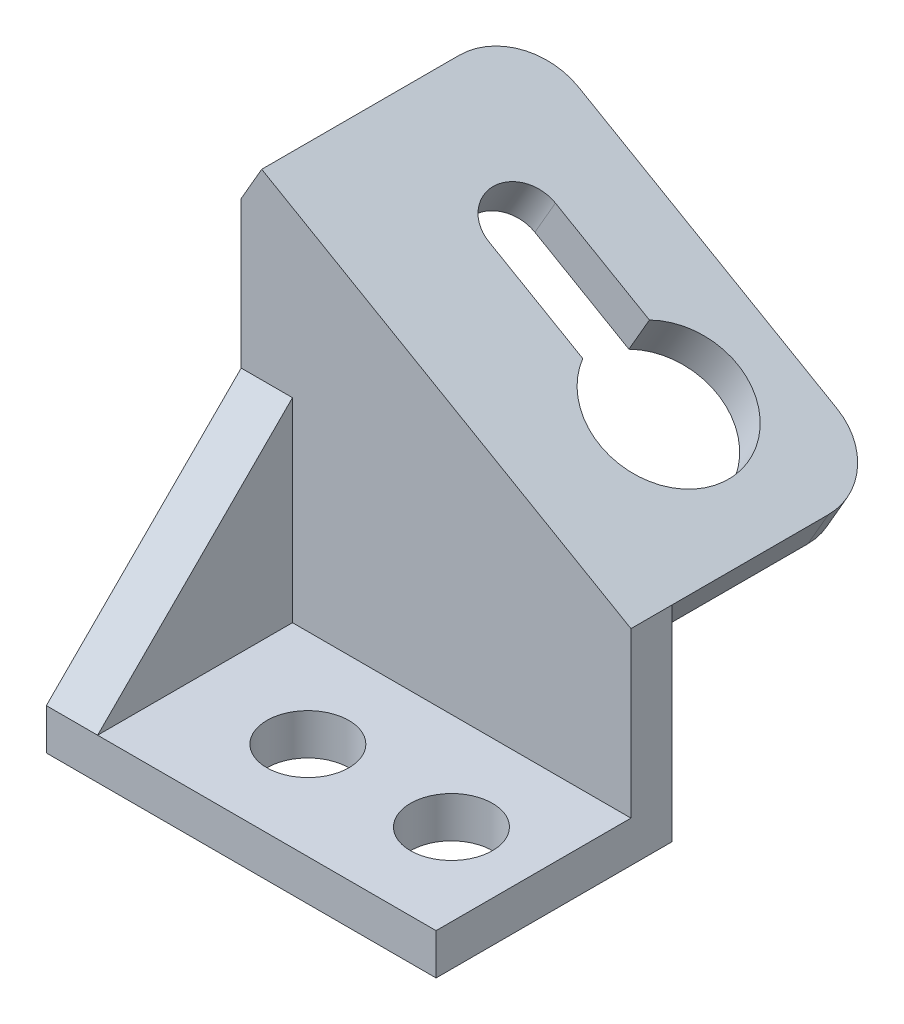
ISO-10303-21;
HEADER;
FILE_DESCRIPTION(('STEP AP214'),'2;1');
FILE_NAME('part.step','',(''),(''),'','','');
FILE_SCHEMA(('AUTOMOTIVE_DESIGN { 1 0 10303 214 1 1 1 1 }'));
ENDSEC;
DATA;
#1=APPLICATION_CONTEXT('core data for automotive mechanical design processes');
#2=APPLICATION_PROTOCOL_DEFINITION('international standard','automotive_design',2000,#1);
#3=PRODUCT_CONTEXT('',#1,'mechanical');
#4=PRODUCT('Part','Part','',(#3));
#5=PRODUCT_RELATED_PRODUCT_CATEGORY('part','',(#4));
#6=PRODUCT_DEFINITION_FORMATION('','',#4);
#7=PRODUCT_DEFINITION_CONTEXT('part definition',#1,'design');
#8=PRODUCT_DEFINITION('design','',#6,#7);
#9=PRODUCT_DEFINITION_SHAPE('','',#8);
#10=(LENGTH_UNIT() NAMED_UNIT(*) SI_UNIT(.MILLI.,.METRE.));
#11=(NAMED_UNIT(*) PLANE_ANGLE_UNIT() SI_UNIT($,.RADIAN.));
#12=(NAMED_UNIT(*) SI_UNIT($,.STERADIAN.) SOLID_ANGLE_UNIT());
#13=UNCERTAINTY_MEASURE_WITH_UNIT(LENGTH_MEASURE(1.E-05),#10,'distance_accuracy_value','');
#14=(GEOMETRIC_REPRESENTATION_CONTEXT(3) GLOBAL_UNCERTAINTY_ASSIGNED_CONTEXT((#13)) GLOBAL_UNIT_ASSIGNED_CONTEXT((#10,
#11,#12)) REPRESENTATION_CONTEXT('',''));
#15=CARTESIAN_POINT('',(0.,0.,0.));
#16=DIRECTION('',(0.,0.,1.));
#17=DIRECTION('',(1.,0.,0.));
#18=AXIS2_PLACEMENT_3D('',#15,#16,#17);
#19=CARTESIAN_POINT('',(32.8564064605511,56.9089653438087,0.));
#20=DIRECTION('',(0.500000000000001,0.866025403784438,0.));
#21=DIRECTION('',(-0.866025403784438,0.500000000000001,0.));
#22=AXIS2_PLACEMENT_3D('',#19,#20,#21);
#23=PLANE('',#22);
#24=DIRECTION('',(0.866025403784438,-0.500000000000001,0.));
#25=VECTOR('',#24,1.);
#26=CARTESIAN_POINT('',(-1.11022302462516E-13,75.8786204584118,-51.));
#27=LINE('',#26,#25);
#28=CARTESIAN_POINT('',(14.8253175473055,67.3192193816532,-51.));
#29=VERTEX_POINT('',#28);
#30=CARTESIAN_POINT('',(65.1746824526946,38.2500000000001,-51.));
#31=VERTEX_POINT('',#30);
#32=EDGE_CURVE('E204',#29,#31,#27,.T.);
#33=ORIENTED_EDGE('',*,*,#32,.F.);
#34=CARTESIAN_POINT('',(14.8253175473055,67.3192193816532,-38.5));
#35=DIRECTION('',(0.500000000000001,0.866025403784438,0.));
#36=DIRECTION('',(-0.866025403784438,0.500000000000001,0.));
#37=AXIS2_PLACEMENT_3D('',#34,#35,#36);
#38=CIRCLE('',#37,12.5);
#39=CARTESIAN_POINT('',(4.,73.5692193816532,-38.5));
#40=VERTEX_POINT('',#39);
#41=EDGE_CURVE('E274',#29,#40,#38,.T.);
#42=ORIENTED_EDGE('',*,*,#41,.T.);
#43=DIRECTION('',(0.,0.,-1.));
#44=VECTOR('',#43,1.);
#45=CARTESIAN_POINT('',(4.,73.5692193816532,0.));
#46=LINE('',#45,#44);
#47=CARTESIAN_POINT('',(4.,73.5692193816532,0.));
#48=VERTEX_POINT('',#47);
#49=EDGE_CURVE('E196',#48,#40,#46,.T.);
#50=ORIENTED_EDGE('',*,*,#49,.F.);
#51=DIRECTION('',(0.866025403784438,-0.500000000000001,0.));
#52=VECTOR('',#51,1.);
#53=CARTESIAN_POINT('',(-26.1503652823171,90.9765408935646,0.));
#54=LINE('',#53,#52);
#55=CARTESIAN_POINT('',(76.,32.,0.));
#56=VERTEX_POINT('',#55);
#57=EDGE_CURVE('E216',#48,#56,#54,.T.);
#58=ORIENTED_EDGE('',*,*,#57,.T.);
#59=DIRECTION('',(0.,0.,-1.));
#60=VECTOR('',#59,1.);
#61=CARTESIAN_POINT('',(76.,32.,0.));
#62=LINE('',#61,#60);
#63=CARTESIAN_POINT('',(76.,32.,-8.));
#64=VERTEX_POINT('',#63);
#65=EDGE_CURVE('E231',#56,#64,#62,.T.);
#66=ORIENTED_EDGE('',*,*,#65,.T.);
#67=DIRECTION('',(0.,0.,-1.));
#68=VECTOR('',#67,1.);
#69=CARTESIAN_POINT('',(76.,32.,0.));
#70=LINE('',#69,#68);
#71=CARTESIAN_POINT('',(76.,32.,-38.5));
#72=VERTEX_POINT('',#71);
#73=EDGE_CURVE('E199',#64,#72,#70,.T.);
#74=ORIENTED_EDGE('',*,*,#73,.T.);
#75=CARTESIAN_POINT('',(65.1746824526945,38.25,-38.5));
#76=DIRECTION('',(0.500000000000001,0.866025403784438,0.));
#77=DIRECTION('',(-0.866025403784438,0.500000000000001,0.));
#78=AXIS2_PLACEMENT_3D('',#75,#76,#77);
#79=CIRCLE('',#78,12.5);
#80=EDGE_CURVE('E272',#72,#31,#79,.T.);
#81=ORIENTED_EDGE('',*,*,#80,.T.);
#82=EDGE_LOOP('',(#33,#42,#50,#58,#66,#74,#81));
#83=FACE_BOUND('',#82,.T.);
#84=DIRECTION('',(0.866025403784438,-0.5,0.));
#85=VECTOR('',#84,1.);
#86=CARTESIAN_POINT('',(25.7705265804309,60.9999999998759,-22.5));
#87=LINE('',#86,#85);
#88=CARTESIAN_POINT('',(25.7705265807177,60.9999999998759,-22.5));
#89=VERTEX_POINT('',#88);
#90=CARTESIAN_POINT('',(44.1024141393578,50.4160797829755,-22.5));
#91=VERTEX_POINT('',#90);
#92=EDGE_CURVE('E165',#89,#91,#87,.T.);
#93=ORIENTED_EDGE('',*,*,#92,.F.);
#94=CARTESIAN_POINT('',(25.7705265804309,60.9999999998759,-29.));
#95=DIRECTION('',(-0.500000000000001,-0.866025403784438,0.));
#96=DIRECTION('',(0.866025403784438,-0.500000000000001,0.));
#97=AXIS2_PLACEMENT_3D('',#94,#95,#96);
#98=CIRCLE('',#97,6.5);
#99=CARTESIAN_POINT('',(25.7705265804309,60.9999999998759,-35.5));
#100=VERTEX_POINT('',#99);
#101=EDGE_CURVE('E47',#89,#100,#98,.T.);
#102=ORIENTED_EDGE('',*,*,#101,.T.);
#103=DIRECTION('',(0.866025403784438,-0.5,0.));
#104=VECTOR('',#103,1.);
#105=CARTESIAN_POINT('',(25.7705265804309,60.9999999998759,-35.5));
#106=LINE('',#105,#104);
#107=CARTESIAN_POINT('',(44.1024141393578,50.4160797829755,-35.5));
#108=VERTEX_POINT('',#107);
#109=EDGE_CURVE('E156',#100,#108,#106,.T.);
#110=ORIENTED_EDGE('',*,*,#109,.T.);
#111=CARTESIAN_POINT('',(54.3493649053174,44.4999999998759,-29.));
#112=DIRECTION('',(-0.500000000000001,-0.866025403784438,0.));
#113=DIRECTION('',(0.866025403784438,-0.500000000000001,0.));
#114=AXIS2_PLACEMENT_3D('',#111,#112,#113);
#115=CIRCLE('',#114,13.5);
#116=EDGE_CURVE('E162',#108,#91,#115,.T.);
#117=ORIENTED_EDGE('',*,*,#116,.T.);
#118=EDGE_LOOP('',(#93,#102,#110,#117));
#119=FACE_BOUND('',#118,.T.);
#120=ADVANCED_FACE('F32',(#83,#119),#23,.T.);
#121=CARTESIAN_POINT('',(72.,25.0717967697245,0.));
#122=DIRECTION('',(0.500000000000002,0.866025403784438,0.));
#123=DIRECTION('',(-0.866025403784438,0.500000000000001,0.));
#124=AXIS2_PLACEMENT_3D('',#121,#122,#123);
#125=PLANE('',#124);
#126=DIRECTION('',(0.,0.,1.));
#127=VECTOR('',#126,1.);
#128=CARTESIAN_POINT('',(0.,66.6410161513777,0.));
#129=LINE('',#128,#127);
#130=CARTESIAN_POINT('',(0.,66.6410161513777,-38.5));
#131=VERTEX_POINT('',#130);
#132=CARTESIAN_POINT('',(0.,66.6410161513777,-8.));
#133=VERTEX_POINT('',#132);
#134=EDGE_CURVE('E259',#131,#133,#129,.T.);
#135=ORIENTED_EDGE('',*,*,#134,.F.);
#136=CARTESIAN_POINT('',(10.8253175473055,60.3910161513777,-38.5));
#137=DIRECTION('',(0.500000000000002,0.866025403784438,0.));
#138=DIRECTION('',(-0.866025403784438,0.500000000000001,0.));
#139=AXIS2_PLACEMENT_3D('',#136,#137,#138);
#140=CIRCLE('',#139,12.5);
#141=CARTESIAN_POINT('',(10.8253175473055,60.3910161513777,-51.));
#142=VERTEX_POINT('',#141);
#143=EDGE_CURVE('E266',#131,#142,#140,.F.);
#144=ORIENTED_EDGE('',*,*,#143,.T.);
#145=DIRECTION('',(0.866025403784438,-0.500000000000001,0.));
#146=VECTOR('',#145,1.);
#147=CARTESIAN_POINT('',(-4.00000000000011,68.9504172281363,-51.));
#148=LINE('',#147,#146);
#149=CARTESIAN_POINT('',(61.1746824526945,31.3217967697246,-51.));
#150=VERTEX_POINT('',#149);
#151=EDGE_CURVE('E203',#142,#150,#148,.T.);
#152=ORIENTED_EDGE('',*,*,#151,.T.);
#153=CARTESIAN_POINT('',(61.1746824526945,31.3217967697246,-38.5));
#154=DIRECTION('',(0.500000000000002,0.866025403784438,0.));
#155=DIRECTION('',(-0.866025403784438,0.500000000000001,0.));
#156=AXIS2_PLACEMENT_3D('',#153,#154,#155);
#157=CIRCLE('',#156,12.5);
#158=CARTESIAN_POINT('',(72.,25.0717967697246,-38.5));
#159=VERTEX_POINT('',#158);
#160=EDGE_CURVE('E264',#150,#159,#157,.F.);
#161=ORIENTED_EDGE('',*,*,#160,.T.);
#162=DIRECTION('',(0.,0.,-1.));
#163=VECTOR('',#162,1.);
#164=CARTESIAN_POINT('',(72.,25.0717967697245,0.));
#165=LINE('',#164,#163);
#166=CARTESIAN_POINT('',(72.,25.0717967697245,-8.));
#167=VERTEX_POINT('',#166);
#168=EDGE_CURVE('E200',#167,#159,#165,.T.);
#169=ORIENTED_EDGE('',*,*,#168,.F.);
#170=DIRECTION('',(0.866025403784438,-0.500000000000001,0.));
#171=VECTOR('',#170,1.);
#172=CARTESIAN_POINT('',(85.8564064605511,17.0717967697245,-8.));
#173=LINE('',#172,#171);
#174=EDGE_CURVE('E213',#133,#167,#173,.T.);
#175=ORIENTED_EDGE('',*,*,#174,.F.);
#176=EDGE_LOOP('',(#135,#144,#152,#161,#169,#175));
#177=FACE_BOUND('',#176,.T.);
#178=CARTESIAN_POINT('',(21.7705265805026,54.0717967697246,-29.));
#179=DIRECTION('',(0.500000000000002,0.866025403784438,0.));
#180=DIRECTION('',(-0.866025403784438,0.500000000000001,0.));
#181=AXIS2_PLACEMENT_3D('',#178,#179,#180);
#182=CIRCLE('',#181,6.5);
#183=CARTESIAN_POINT('',(21.7705265805026,54.0717967697246,-22.5));
#184=VERTEX_POINT('',#183);
#185=CARTESIAN_POINT('',(21.7705265805026,54.0717967697246,-35.5));
#186=VERTEX_POINT('',#185);
#187=EDGE_CURVE('E11',#184,#186,#182,.F.);
#188=ORIENTED_EDGE('',*,*,#187,.F.);
#189=DIRECTION('',(0.866025403784438,-0.500000000000001,0.));
#190=VECTOR('',#189,1.);
#191=CARTESIAN_POINT('',(72.,25.0717967697245,-22.5));
#192=LINE('',#191,#190);
#193=CARTESIAN_POINT('',(40.1024141394295,43.4878765528242,-22.5));
#194=VERTEX_POINT('',#193);
#195=EDGE_CURVE('E279',#184,#194,#192,.T.);
#196=ORIENTED_EDGE('',*,*,#195,.T.);
#197=CARTESIAN_POINT('',(50.3493649053891,37.5717967697246,-29.));
#198=DIRECTION('',(0.500000000000002,0.866025403784438,0.));
#199=DIRECTION('',(-0.866025403784438,0.500000000000001,0.));
#200=AXIS2_PLACEMENT_3D('',#197,#198,#199);
#201=CIRCLE('',#200,13.5);
#202=CARTESIAN_POINT('',(40.1024141394295,43.4878765528242,-35.5));
#203=VERTEX_POINT('',#202);
#204=EDGE_CURVE('E282',#203,#194,#201,.F.);
#205=ORIENTED_EDGE('',*,*,#204,.F.);
#206=DIRECTION('',(0.866025403784438,-0.500000000000001,0.));
#207=VECTOR('',#206,1.);
#208=CARTESIAN_POINT('',(72.,25.0717967697246,-35.5));
#209=LINE('',#208,#207);
#210=EDGE_CURVE('E40',#186,#203,#209,.T.);
#211=ORIENTED_EDGE('',*,*,#210,.F.);
#212=EDGE_LOOP('',(#188,#196,#205,#211));
#213=FACE_BOUND('',#212,.T.);
#214=ADVANCED_FACE('F287',(#177,#213),#125,.F.);
#215=CARTESIAN_POINT('',(76.,0.,0.));
#216=DIRECTION('',(0.,0.,-1.));
#217=DIRECTION('',(-1.,0.,0.));
#218=AXIS2_PLACEMENT_3D('',#215,#216,#217);
#219=PLANE('',#218);
#220=DIRECTION('',(0.,-1.,0.));
#221=VECTOR('',#220,1.);
#222=CARTESIAN_POINT('',(0.,0.,0.));
#223=LINE('',#222,#221);
#224=CARTESIAN_POINT('',(0.,66.6410161513777,0.));
#225=VERTEX_POINT('',#224);
#226=CARTESIAN_POINT('',(0.,38.,0.));
#227=VERTEX_POINT('',#226);
#228=EDGE_CURVE('E222',#225,#227,#223,.T.);
#229=ORIENTED_EDGE('',*,*,#228,.T.);
#230=DIRECTION('',(-1.,0.,0.));
#231=VECTOR('',#230,1.);
#232=CARTESIAN_POINT('',(10.,38.,0.));
#233=LINE('',#232,#231);
#234=CARTESIAN_POINT('',(10.,38.,0.));
#235=VERTEX_POINT('',#234);
#236=EDGE_CURVE('E190',#235,#227,#233,.T.);
#237=ORIENTED_EDGE('',*,*,#236,.F.);
#238=DIRECTION('',(0.,-1.,0.));
#239=VECTOR('',#238,1.);
#240=CARTESIAN_POINT('',(10.,38.,0.));
#241=LINE('',#240,#239);
#242=CARTESIAN_POINT('',(9.99999999999999,0.,0.));
#243=VERTEX_POINT('',#242);
#244=EDGE_CURVE('E184',#235,#243,#241,.T.);
#245=ORIENTED_EDGE('',*,*,#244,.T.);
#246=DIRECTION('',(-1.,0.,0.));
#247=VECTOR('',#246,1.);
#248=CARTESIAN_POINT('',(76.,0.,0.));
#249=LINE('',#248,#247);
#250=CARTESIAN_POINT('',(76.,0.,0.));
#251=VERTEX_POINT('',#250);
#252=EDGE_CURVE('E236',#251,#243,#249,.T.);
#253=ORIENTED_EDGE('',*,*,#252,.F.);
#254=DIRECTION('',(0.,-1.,0.));
#255=VECTOR('',#254,1.);
#256=CARTESIAN_POINT('',(76.,0.,0.));
#257=LINE('',#256,#255);
#258=EDGE_CURVE('E234',#56,#251,#257,.T.);
#259=ORIENTED_EDGE('',*,*,#258,.F.);
#260=ORIENTED_EDGE('',*,*,#57,.F.);
#261=DIRECTION('',(0.5,0.866025403784439,0.));
#262=VECTOR('',#261,1.);
#263=CARTESIAN_POINT('',(0.,66.6410161513777,0.));
#264=LINE('',#263,#262);
#265=EDGE_CURVE('E192',#225,#48,#264,.T.);
#266=ORIENTED_EDGE('',*,*,#265,.F.);
#267=EDGE_LOOP('',(#229,#237,#245,#253,#259,#260,#266));
#268=FACE_BOUND('',#267,.T.);
#269=ADVANCED_FACE('F306',(#268),#219,.F.);
#270=CARTESIAN_POINT('',(-4.00000000000011,68.9504172281363,-51.));
#271=DIRECTION('',(0.,0.,1.));
#272=DIRECTION('',(1.,0.,0.));
#273=AXIS2_PLACEMENT_3D('',#270,#271,#272);
#274=PLANE('',#273);
#275=ORIENTED_EDGE('',*,*,#151,.F.);
#276=DIRECTION('',(-0.5,-0.866025403784439,0.));
#277=VECTOR('',#276,1.);
#278=CARTESIAN_POINT('',(14.8253175473055,67.3192193816532,-51.));
#279=LINE('',#278,#277);
#280=EDGE_CURVE('E270',#142,#29,#279,.F.);
#281=ORIENTED_EDGE('',*,*,#280,.T.);
#282=ORIENTED_EDGE('',*,*,#32,.T.);
#283=DIRECTION('',(0.500000000000002,0.866025403784438,0.));
#284=VECTOR('',#283,1.);
#285=CARTESIAN_POINT('',(61.1746824526945,31.3217967697246,-51.));
#286=LINE('',#285,#284);
#287=EDGE_CURVE('E268',#31,#150,#286,.F.);
#288=ORIENTED_EDGE('',*,*,#287,.T.);
#289=EDGE_LOOP('',(#275,#281,#282,#288));
#290=FACE_BOUND('',#289,.T.);
#291=ADVANCED_FACE('F323',(#290),#274,.F.);
#292=CARTESIAN_POINT('',(0.,0.,38.));
#293=DIRECTION('',(-1.,0.,0.));
#294=DIRECTION('',(0.,0.,1.));
#295=AXIS2_PLACEMENT_3D('',#292,#293,#294);
#296=PLANE('',#295);
#297=ORIENTED_EDGE('',*,*,#228,.F.);
#298=DIRECTION('',(0.,0.,-1.));
#299=VECTOR('',#298,1.);
#300=CARTESIAN_POINT('',(0.,66.6410161513777,38.));
#301=LINE('',#300,#299);
#302=EDGE_CURVE('E256',#225,#133,#301,.T.);
#303=ORIENTED_EDGE('',*,*,#302,.T.);
#304=DIRECTION('',(0.,1.,0.));
#305=VECTOR('',#304,1.);
#306=CARTESIAN_POINT('',(0.,0.,-8.));
#307=LINE('',#306,#305);
#308=CARTESIAN_POINT('',(0.,-7.99999999999999,-8.));
#309=VERTEX_POINT('',#308);
#310=EDGE_CURVE('E242',#133,#309,#307,.F.);
#311=ORIENTED_EDGE('',*,*,#310,.T.);
#312=DIRECTION('',(0.,0.,1.));
#313=VECTOR('',#312,1.);
#314=CARTESIAN_POINT('',(0.,-7.99999999999999,0.));
#315=LINE('',#314,#313);
#316=CARTESIAN_POINT('',(0.,-8.00000000000001,38.));
#317=VERTEX_POINT('',#316);
#318=EDGE_CURVE('E239',#309,#317,#315,.T.);
#319=ORIENTED_EDGE('',*,*,#318,.T.);
#320=DIRECTION('',(0.,1.,0.));
#321=VECTOR('',#320,1.);
#322=CARTESIAN_POINT('',(0.,-8.00000000000001,38.));
#323=LINE('',#322,#321);
#324=CARTESIAN_POINT('',(0.,0.,38.));
#325=VERTEX_POINT('',#324);
#326=EDGE_CURVE('E218',#317,#325,#323,.T.);
#327=ORIENTED_EDGE('',*,*,#326,.T.);
#328=DIRECTION('',(0.,0.707106781186548,-0.707106781186547));
#329=VECTOR('',#328,1.);
#330=CARTESIAN_POINT('',(0.,0.,38.));
#331=LINE('',#330,#329);
#332=EDGE_CURVE('E152',#325,#227,#331,.T.);
#333=ORIENTED_EDGE('',*,*,#332,.T.);
#334=EDGE_LOOP('',(#297,#303,#311,#319,#327,#333));
#335=FACE_BOUND('',#334,.T.);
#336=ADVANCED_FACE('F319',(#335),#296,.T.);
#337=CARTESIAN_POINT('',(76.,0.,0.));
#338=DIRECTION('',(0.,-1.,0.));
#339=DIRECTION('',(0.,0.,-1.));
#340=AXIS2_PLACEMENT_3D('',#337,#338,#339);
#341=PLANE('',#340);
#342=CARTESIAN_POINT('',(32.,0.,19.));
#343=DIRECTION('',(0.,1.,0.));
#344=DIRECTION('',(0.,0.,1.));
#345=AXIS2_PLACEMENT_3D('',#342,#343,#344);
#346=CIRCLE('',#345,8.);
#347=CARTESIAN_POINT('',(32.,0.,27.));
#348=VERTEX_POINT('',#347);
#349=EDGE_CURVE('E427',#348,#348,#346,.T.);
#350=ORIENTED_EDGE('',*,*,#349,.F.);
#351=EDGE_LOOP('',(#350));
#352=FACE_BOUND('',#351,.T.);
#353=CARTESIAN_POINT('',(60.,0.,19.));
#354=DIRECTION('',(0.,1.,0.));
#355=DIRECTION('',(0.,0.,1.));
#356=AXIS2_PLACEMENT_3D('',#353,#354,#355);
#357=CIRCLE('',#356,8.);
#358=CARTESIAN_POINT('',(60.,0.,27.));
#359=VERTEX_POINT('',#358);
#360=EDGE_CURVE('E169',#359,#359,#357,.T.);
#361=ORIENTED_EDGE('',*,*,#360,.F.);
#362=EDGE_LOOP('',(#361));
#363=FACE_BOUND('',#362,.T.);
#364=ORIENTED_EDGE('',*,*,#252,.T.);
#365=DIRECTION('',(0.,0.,1.));
#366=VECTOR('',#365,1.);
#367=CARTESIAN_POINT('',(9.99999999999999,0.,0.));
#368=LINE('',#367,#366);
#369=CARTESIAN_POINT('',(9.99999999999999,0.,38.));
#370=VERTEX_POINT('',#369);
#371=EDGE_CURVE('E179',#243,#370,#368,.T.);
#372=ORIENTED_EDGE('',*,*,#371,.T.);
#373=DIRECTION('',(-1.,0.,0.));
#374=VECTOR('',#373,1.);
#375=CARTESIAN_POINT('',(76.,0.,38.));
#376=LINE('',#375,#374);
#377=CARTESIAN_POINT('',(76.,0.,38.));
#378=VERTEX_POINT('',#377);
#379=EDGE_CURVE('E253',#378,#370,#376,.T.);
#380=ORIENTED_EDGE('',*,*,#379,.F.);
#381=DIRECTION('',(0.,0.,1.));
#382=VECTOR('',#381,1.);
#383=CARTESIAN_POINT('',(76.,0.,0.));
#384=LINE('',#383,#382);
#385=EDGE_CURVE('E219',#251,#378,#384,.T.);
#386=ORIENTED_EDGE('',*,*,#385,.F.);
#387=EDGE_LOOP('',(#364,#372,#380,#386));
#388=FACE_BOUND('',#387,.T.);
#389=ADVANCED_FACE('F322',(#352,#363,#388),#341,.F.);
#390=CARTESIAN_POINT('',(76.,-8.,38.));
#391=DIRECTION('',(0.,0.,1.));
#392=DIRECTION('',(1.,0.,0.));
#393=AXIS2_PLACEMENT_3D('',#390,#391,#392);
#394=PLANE('',#393);
#395=ORIENTED_EDGE('',*,*,#326,.F.);
#396=DIRECTION('',(-1.,0.,0.));
#397=VECTOR('',#396,1.);
#398=CARTESIAN_POINT('',(76.,-8.,38.));
#399=LINE('',#398,#397);
#400=CARTESIAN_POINT('',(76.,-8.,38.));
#401=VERTEX_POINT('',#400);
#402=EDGE_CURVE('E251',#401,#317,#399,.T.);
#403=ORIENTED_EDGE('',*,*,#402,.F.);
#404=DIRECTION('',(0.,1.,0.));
#405=VECTOR('',#404,1.);
#406=CARTESIAN_POINT('',(76.,-8.,38.));
#407=LINE('',#406,#405);
#408=EDGE_CURVE('E221',#401,#378,#407,.T.);
#409=ORIENTED_EDGE('',*,*,#408,.T.);
#410=ORIENTED_EDGE('',*,*,#379,.T.);
#411=DIRECTION('',(-1.,0.,0.));
#412=VECTOR('',#411,1.);
#413=CARTESIAN_POINT('',(9.99999999999999,0.,38.));
#414=LINE('',#413,#412);
#415=EDGE_CURVE('E187',#370,#325,#414,.T.);
#416=ORIENTED_EDGE('',*,*,#415,.T.);
#417=EDGE_LOOP('',(#395,#403,#409,#410,#416));
#418=FACE_BOUND('',#417,.T.);
#419=ADVANCED_FACE('F334',(#418),#394,.T.);
#420=CARTESIAN_POINT('',(76.,-7.99999999999998,0.));
#421=DIRECTION('',(0.,-1.,0.));
#422=DIRECTION('',(0.,0.,-1.));
#423=AXIS2_PLACEMENT_3D('',#420,#421,#422);
#424=PLANE('',#423);
#425=CARTESIAN_POINT('',(32.,-8.,19.));
#426=DIRECTION('',(0.,1.,0.));
#427=DIRECTION('',(0.,0.,1.));
#428=AXIS2_PLACEMENT_3D('',#425,#426,#427);
#429=CIRCLE('',#428,8.);
#430=CARTESIAN_POINT('',(32.,-8.,27.));
#431=VERTEX_POINT('',#430);
#432=EDGE_CURVE('E424',#431,#431,#429,.T.);
#433=ORIENTED_EDGE('',*,*,#432,.T.);
#434=EDGE_LOOP('',(#433));
#435=FACE_BOUND('',#434,.T.);
#436=CARTESIAN_POINT('',(60.,-7.99999999999997,19.));
#437=DIRECTION('',(0.,1.,0.));
#438=DIRECTION('',(0.,0.,1.));
#439=AXIS2_PLACEMENT_3D('',#436,#437,#438);
#440=CIRCLE('',#439,8.);
#441=CARTESIAN_POINT('',(60.,-7.99999999999997,27.));
#442=VERTEX_POINT('',#441);
#443=EDGE_CURVE('E166',#442,#442,#440,.T.);
#444=ORIENTED_EDGE('',*,*,#443,.T.);
#445=EDGE_LOOP('',(#444));
#446=FACE_BOUND('',#445,.T.);
#447=ORIENTED_EDGE('',*,*,#318,.F.);
#448=DIRECTION('',(-1.,0.,0.));
#449=VECTOR('',#448,1.);
#450=CARTESIAN_POINT('',(76.,-7.99999999999998,-8.));
#451=LINE('',#450,#449);
#452=CARTESIAN_POINT('',(76.,-7.99999999999998,-8.));
#453=VERTEX_POINT('',#452);
#454=EDGE_CURVE('E248',#453,#309,#451,.T.);
#455=ORIENTED_EDGE('',*,*,#454,.F.);
#456=DIRECTION('',(0.,0.,1.));
#457=VECTOR('',#456,1.);
#458=CARTESIAN_POINT('',(76.,-7.99999999999998,0.));
#459=LINE('',#458,#457);
#460=EDGE_CURVE('E225',#453,#401,#459,.T.);
#461=ORIENTED_EDGE('',*,*,#460,.T.);
#462=ORIENTED_EDGE('',*,*,#402,.T.);
#463=EDGE_LOOP('',(#447,#455,#461,#462));
#464=FACE_BOUND('',#463,.T.);
#465=ADVANCED_FACE('F330',(#435,#446,#464),#424,.T.);
#466=CARTESIAN_POINT('',(76.,0.,-8.));
#467=DIRECTION('',(0.,0.,-1.));
#468=DIRECTION('',(-1.,0.,0.));
#469=AXIS2_PLACEMENT_3D('',#466,#467,#468);
#470=PLANE('',#469);
#471=DIRECTION('',(-0.500000000000002,-0.866025403784438,0.));
#472=VECTOR('',#471,1.);
#473=CARTESIAN_POINT('',(62.143593539449,8.00000000000006,-8.));
#474=LINE('',#473,#472);
#475=EDGE_CURVE('E207',#64,#167,#474,.T.);
#476=ORIENTED_EDGE('',*,*,#475,.F.);
#477=DIRECTION('',(0.,1.,0.));
#478=VECTOR('',#477,1.);
#479=CARTESIAN_POINT('',(76.,0.,-8.));
#480=LINE('',#479,#478);
#481=EDGE_CURVE('E228',#64,#453,#480,.F.);
#482=ORIENTED_EDGE('',*,*,#481,.T.);
#483=ORIENTED_EDGE('',*,*,#454,.T.);
#484=ORIENTED_EDGE('',*,*,#310,.F.);
#485=ORIENTED_EDGE('',*,*,#174,.T.);
#486=EDGE_LOOP('',(#476,#482,#483,#484,#485));
#487=FACE_BOUND('',#486,.T.);
#488=ADVANCED_FACE('F317',(#487),#470,.T.);
#489=CARTESIAN_POINT('',(76.,0.,38.));
#490=DIRECTION('',(-1.,0.,0.));
#491=DIRECTION('',(0.,0.,1.));
#492=AXIS2_PLACEMENT_3D('',#489,#490,#491);
#493=PLANE('',#492);
#494=ORIENTED_EDGE('',*,*,#385,.T.);
#495=ORIENTED_EDGE('',*,*,#408,.F.);
#496=ORIENTED_EDGE('',*,*,#460,.F.);
#497=ORIENTED_EDGE('',*,*,#481,.F.);
#498=ORIENTED_EDGE('',*,*,#65,.F.);
#499=ORIENTED_EDGE('',*,*,#258,.T.);
#500=EDGE_LOOP('',(#494,#495,#496,#497,#498,#499));
#501=FACE_BOUND('',#500,.T.);
#502=ADVANCED_FACE('F314',(#501),#493,.F.);
#503=CARTESIAN_POINT('',(72.,25.0717967697245,0.));
#504=DIRECTION('',(0.866025403784438,-0.500000000000001,0.));
#505=DIRECTION('',(0.500000000000002,0.866025403784438,0.));
#506=AXIS2_PLACEMENT_3D('',#503,#504,#505);
#507=PLANE('',#506);
#508=ORIENTED_EDGE('',*,*,#168,.T.);
#509=DIRECTION('',(0.500000000000002,0.866025403784438,0.));
#510=VECTOR('',#509,1.);
#511=CARTESIAN_POINT('',(76.,32.,-38.5));
#512=LINE('',#511,#510);
#513=EDGE_CURVE('E276',#159,#72,#512,.T.);
#514=ORIENTED_EDGE('',*,*,#513,.T.);
#515=ORIENTED_EDGE('',*,*,#73,.F.);
#516=ORIENTED_EDGE('',*,*,#475,.T.);
#517=EDGE_LOOP('',(#508,#514,#515,#516));
#518=FACE_BOUND('',#517,.T.);
#519=ADVANCED_FACE('F312',(#518),#507,.T.);
#520=CARTESIAN_POINT('',(0.,66.6410161513777,0.));
#521=DIRECTION('',(-0.866025403784439,0.499999999999999,0.));
#522=DIRECTION('',(-0.5,-0.866025403784439,0.));
#523=AXIS2_PLACEMENT_3D('',#520,#521,#522);
#524=PLANE('',#523);
#525=ORIENTED_EDGE('',*,*,#49,.T.);
#526=DIRECTION('',(-0.5,-0.866025403784439,0.));
#527=VECTOR('',#526,1.);
#528=CARTESIAN_POINT('',(0.,66.6410161513777,-38.5));
#529=LINE('',#528,#527);
#530=EDGE_CURVE('E261',#40,#131,#529,.T.);
#531=ORIENTED_EDGE('',*,*,#530,.T.);
#532=ORIENTED_EDGE('',*,*,#134,.T.);
#533=ORIENTED_EDGE('',*,*,#302,.F.);
#534=ORIENTED_EDGE('',*,*,#265,.T.);
#535=EDGE_LOOP('',(#525,#531,#532,#533,#534));
#536=FACE_BOUND('',#535,.T.);
#537=ADVANCED_FACE('F343',(#536),#524,.T.);
#538=CARTESIAN_POINT('',(10.8253175473055,60.3910161513777,-38.5));
#539=DIRECTION('',(0.5,0.866025403784439,0.));
#540=DIRECTION('',(-0.866025403784439,0.499999999999999,0.));
#541=AXIS2_PLACEMENT_3D('',#538,#539,#540);
#542=CYLINDRICAL_SURFACE('',#541,12.5);
#543=ORIENTED_EDGE('',*,*,#41,.F.);
#544=ORIENTED_EDGE('',*,*,#280,.F.);
#545=ORIENTED_EDGE('',*,*,#143,.F.);
#546=ORIENTED_EDGE('',*,*,#530,.F.);
#547=EDGE_LOOP('',(#543,#544,#545,#546));
#548=FACE_BOUND('',#547,.T.);
#549=ADVANCED_FACE('F341',(#548),#542,.T.);
#550=CARTESIAN_POINT('',(61.1746824526945,31.3217967697245,-38.5));
#551=DIRECTION('',(-0.500000000000002,-0.866025403784438,0.));
#552=DIRECTION('',(0.866025403784438,-0.500000000000001,0.));
#553=AXIS2_PLACEMENT_3D('',#550,#551,#552);
#554=CYLINDRICAL_SURFACE('',#553,12.5);
#555=ORIENTED_EDGE('',*,*,#160,.F.);
#556=ORIENTED_EDGE('',*,*,#287,.F.);
#557=ORIENTED_EDGE('',*,*,#80,.F.);
#558=ORIENTED_EDGE('',*,*,#513,.F.);
#559=EDGE_LOOP('',(#555,#556,#557,#558));
#560=FACE_BOUND('',#559,.T.);
#561=ADVANCED_FACE('F34',(#560),#554,.T.);
#562=CARTESIAN_POINT('',(9.99999999999999,0.,38.));
#563=DIRECTION('',(0.,0.707106781186547,0.707106781186548));
#564=DIRECTION('',(0.,-0.707106781186548,0.707106781186547));
#565=AXIS2_PLACEMENT_3D('',#562,#563,#564);
#566=PLANE('',#565);
#567=ORIENTED_EDGE('',*,*,#332,.F.);
#568=ORIENTED_EDGE('',*,*,#415,.F.);
#569=DIRECTION('',(0.,0.707106781186548,-0.707106781186547));
#570=VECTOR('',#569,1.);
#571=CARTESIAN_POINT('',(9.99999999999999,0.,38.));
#572=LINE('',#571,#570);
#573=EDGE_CURVE('E182',#370,#235,#572,.T.);
#574=ORIENTED_EDGE('',*,*,#573,.T.);
#575=ORIENTED_EDGE('',*,*,#236,.T.);
#576=EDGE_LOOP('',(#567,#568,#574,#575));
#577=FACE_BOUND('',#576,.T.);
#578=ADVANCED_FACE('F349',(#577),#566,.T.);
#579=CARTESIAN_POINT('',(9.99999999999999,0.,0.));
#580=DIRECTION('',(1.,0.,0.));
#581=DIRECTION('',(0.,0.,-1.));
#582=AXIS2_PLACEMENT_3D('',#579,#580,#581);
#583=PLANE('',#582);
#584=ORIENTED_EDGE('',*,*,#371,.F.);
#585=ORIENTED_EDGE('',*,*,#244,.F.);
#586=ORIENTED_EDGE('',*,*,#573,.F.);
#587=EDGE_LOOP('',(#584,#585,#586));
#588=FACE_BOUND('',#587,.T.);
#589=ADVANCED_FACE('F374',(#588),#583,.T.);
#590=CARTESIAN_POINT('',(-10.5499814951863,-1.90896534380858,-29.));
#591=DIRECTION('',(0.500000000000002,0.866025403784438,0.));
#592=DIRECTION('',(-0.866025403784438,0.500000000000001,0.));
#593=AXIS2_PLACEMENT_3D('',#590,#591,#592);
#594=CYLINDRICAL_SURFACE('',#593,6.5);
#595=ORIENTED_EDGE('',*,*,#187,.T.);
#596=DIRECTION('',(0.500000000000002,0.866025403784438,0.));
#597=VECTOR('',#596,1.);
#598=CARTESIAN_POINT('',(-10.5499814951863,-1.90896534380861,-35.5));
#599=LINE('',#598,#597);
#600=EDGE_CURVE('E146',#186,#100,#599,.T.);
#601=ORIENTED_EDGE('',*,*,#600,.T.);
#602=ORIENTED_EDGE('',*,*,#101,.F.);
#603=DIRECTION('',(0.500000000000002,0.866025403784438,0.));
#604=VECTOR('',#603,1.);
#605=CARTESIAN_POINT('',(-10.5499814951863,-1.90896534380861,-22.5));
#606=LINE('',#605,#604);
#607=EDGE_CURVE('E175',#184,#89,#606,.T.);
#608=ORIENTED_EDGE('',*,*,#607,.F.);
#609=EDGE_LOOP('',(#595,#601,#602,#608));
#610=FACE_BOUND('',#609,.T.);
#611=ADVANCED_FACE('F148',(#610),#594,.F.);
#612=CARTESIAN_POINT('',(-10.5499814951863,-1.90896534380861,-35.5));
#613=DIRECTION('',(0.,0.,1.));
#614=DIRECTION('',(1.,0.,0.));
#615=AXIS2_PLACEMENT_3D('',#612,#613,#614);
#616=PLANE('',#615);
#617=ORIENTED_EDGE('',*,*,#210,.T.);
#618=DIRECTION('',(0.500000000000002,0.866025403784438,0.));
#619=VECTOR('',#618,1.);
#620=CARTESIAN_POINT('',(7.78190606374058,-12.492885560709,-35.5));
#621=LINE('',#620,#619);
#622=EDGE_CURVE('E153',#203,#108,#621,.T.);
#623=ORIENTED_EDGE('',*,*,#622,.T.);
#624=ORIENTED_EDGE('',*,*,#109,.F.);
#625=ORIENTED_EDGE('',*,*,#600,.F.);
#626=EDGE_LOOP('',(#617,#623,#624,#625));
#627=FACE_BOUND('',#626,.T.);
#628=ADVANCED_FACE('F157',(#627),#616,.T.);
#629=CARTESIAN_POINT('',(18.0288568297002,-18.4089653438086,-29.));
#630=DIRECTION('',(0.500000000000002,0.866025403784438,0.));
#631=DIRECTION('',(-0.866025403784438,0.500000000000001,0.));
#632=AXIS2_PLACEMENT_3D('',#629,#630,#631);
#633=CYLINDRICAL_SURFACE('',#632,13.5);
#634=ORIENTED_EDGE('',*,*,#204,.T.);
#635=DIRECTION('',(0.500000000000002,0.866025403784438,0.));
#636=VECTOR('',#635,1.);
#637=CARTESIAN_POINT('',(7.78190606374056,-12.492885560709,-22.5));
#638=LINE('',#637,#636);
#639=EDGE_CURVE('E55',#194,#91,#638,.T.);
#640=ORIENTED_EDGE('',*,*,#639,.T.);
#641=ORIENTED_EDGE('',*,*,#116,.F.);
#642=ORIENTED_EDGE('',*,*,#622,.F.);
#643=EDGE_LOOP('',(#634,#640,#641,#642));
#644=FACE_BOUND('',#643,.T.);
#645=ADVANCED_FACE('F286',(#644),#633,.F.);
#646=CARTESIAN_POINT('',(-10.5499814951863,-1.90896534380861,-22.5));
#647=DIRECTION('',(0.,0.,1.));
#648=DIRECTION('',(1.,0.,0.));
#649=AXIS2_PLACEMENT_3D('',#646,#647,#648);
#650=PLANE('',#649);
#651=ORIENTED_EDGE('',*,*,#607,.T.);
#652=ORIENTED_EDGE('',*,*,#92,.T.);
#653=ORIENTED_EDGE('',*,*,#639,.F.);
#654=ORIENTED_EDGE('',*,*,#195,.F.);
#655=EDGE_LOOP('',(#651,#652,#653,#654));
#656=FACE_BOUND('',#655,.T.);
#657=ADVANCED_FACE('F288',(#656),#650,.F.);
#658=CARTESIAN_POINT('',(60.,-7.99999999999997,19.));
#659=DIRECTION('',(0.,1.,0.));
#660=DIRECTION('',(0.,0.,1.));
#661=AXIS2_PLACEMENT_3D('',#658,#659,#660);
#662=CYLINDRICAL_SURFACE('',#661,8.);
#663=ORIENTED_EDGE('',*,*,#443,.F.);
#664=EDGE_LOOP('',(#663));
#665=FACE_BOUND('',#664,.T.);
#666=ORIENTED_EDGE('',*,*,#360,.T.);
#667=EDGE_LOOP('',(#666));
#668=FACE_BOUND('',#667,.T.);
#669=ADVANCED_FACE('F290',(#665,#668),#662,.F.);
#670=CARTESIAN_POINT('',(32.,-8.,19.));
#671=DIRECTION('',(0.,1.,0.));
#672=DIRECTION('',(0.,0.,1.));
#673=AXIS2_PLACEMENT_3D('',#670,#671,#672);
#674=CYLINDRICAL_SURFACE('',#673,8.);
#675=ORIENTED_EDGE('',*,*,#432,.F.);
#676=EDGE_LOOP('',(#675));
#677=FACE_BOUND('',#676,.T.);
#678=ORIENTED_EDGE('',*,*,#349,.T.);
#679=EDGE_LOOP('',(#678));
#680=FACE_BOUND('',#679,.T.);
#681=ADVANCED_FACE('F296',(#677,#680),#674,.F.);
#682=CLOSED_SHELL('',(#120,#214,#269,#291,#336,#389,#419,#465,#488,#502,#519,#537,#549,#561,
#578,#589,#611,#628,#645,#657,#669,#681));
#683=MANIFOLD_SOLID_BREP('B2',#682);
#684=ADVANCED_BREP_SHAPE_REPRESENTATION('',(#18,#683),#14);
#685=SHAPE_DEFINITION_REPRESENTATION(#9,#684);
ENDSEC;
END-ISO-10303-21;
